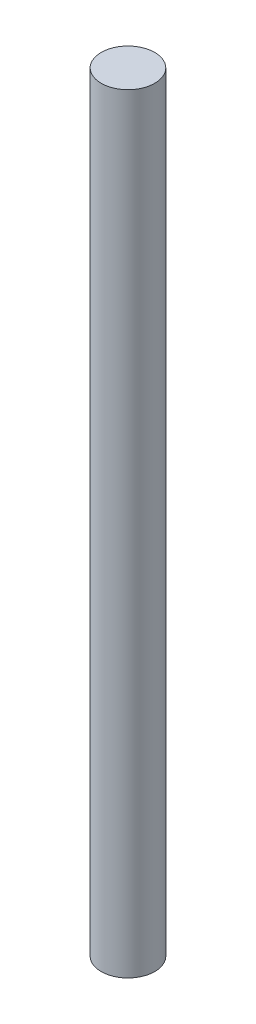
ISO-10303-21;
HEADER;
FILE_DESCRIPTION(('STEP AP214'),'2;1');
FILE_NAME('part.step','',(''),(''),'','','');
FILE_SCHEMA(('AUTOMOTIVE_DESIGN { 1 0 10303 214 1 1 1 1 }'));
ENDSEC;
DATA;
#1=APPLICATION_CONTEXT('core data for automotive mechanical design processes');
#2=APPLICATION_PROTOCOL_DEFINITION('international standard','automotive_design',2000,#1);
#3=PRODUCT_CONTEXT('',#1,'mechanical');
#4=PRODUCT('Part','Part','',(#3));
#5=PRODUCT_RELATED_PRODUCT_CATEGORY('part','',(#4));
#6=PRODUCT_DEFINITION_FORMATION('','',#4);
#7=PRODUCT_DEFINITION_CONTEXT('part definition',#1,'design');
#8=PRODUCT_DEFINITION('design','',#6,#7);
#9=PRODUCT_DEFINITION_SHAPE('','',#8);
#10=(LENGTH_UNIT() NAMED_UNIT(*) SI_UNIT(.MILLI.,.METRE.));
#11=(NAMED_UNIT(*) PLANE_ANGLE_UNIT() SI_UNIT($,.RADIAN.));
#12=(NAMED_UNIT(*) SI_UNIT($,.STERADIAN.) SOLID_ANGLE_UNIT());
#13=UNCERTAINTY_MEASURE_WITH_UNIT(LENGTH_MEASURE(1.E-05),#10,'distance_accuracy_value','');
#14=(GEOMETRIC_REPRESENTATION_CONTEXT(3) GLOBAL_UNCERTAINTY_ASSIGNED_CONTEXT((#13)) GLOBAL_UNIT_ASSIGNED_CONTEXT((#10,
#11,#12)) REPRESENTATION_CONTEXT('',''));
#15=CARTESIAN_POINT('',(0.,0.,0.));
#16=DIRECTION('',(0.,0.,1.));
#17=DIRECTION('',(1.,0.,0.));
#18=AXIS2_PLACEMENT_3D('',#15,#16,#17);
#19=CARTESIAN_POINT('',(0.,115.,0.));
#20=DIRECTION('',(0.,-1.,0.));
#21=DIRECTION('',(0.,0.,-1.));
#22=AXIS2_PLACEMENT_3D('',#19,#20,#21);
#23=CYLINDRICAL_SURFACE('',#22,4.);
#24=CARTESIAN_POINT('',(0.,115.,0.));
#25=DIRECTION('',(0.,1.,0.));
#26=DIRECTION('',(0.,0.,1.));
#27=AXIS2_PLACEMENT_3D('',#24,#25,#26);
#28=CIRCLE('',#27,4.);
#29=CARTESIAN_POINT('',(0.,115.,4.));
#30=VERTEX_POINT('',#29);
#31=EDGE_CURVE('E10',#30,#30,#28,.T.);
#32=ORIENTED_EDGE('',*,*,#31,.F.);
#33=EDGE_LOOP('',(#32));
#34=FACE_BOUND('',#33,.T.);
#35=CARTESIAN_POINT('',(0.,0.,0.));
#36=DIRECTION('',(0.,1.,0.));
#37=DIRECTION('',(0.,0.,1.));
#38=AXIS2_PLACEMENT_3D('',#35,#36,#37);
#39=CIRCLE('',#38,4.);
#40=CARTESIAN_POINT('',(0.,0.,4.));
#41=VERTEX_POINT('',#40);
#42=EDGE_CURVE('E46',#41,#41,#39,.T.);
#43=ORIENTED_EDGE('',*,*,#42,.T.);
#44=EDGE_LOOP('',(#43));
#45=FACE_BOUND('',#44,.T.);
#46=ADVANCED_FACE('F43',(#34,#45),#23,.T.);
#47=CARTESIAN_POINT('',(0.,115.,0.));
#48=DIRECTION('',(0.,1.,0.));
#49=DIRECTION('',(0.,0.,1.));
#50=AXIS2_PLACEMENT_3D('',#47,#48,#49);
#51=PLANE('',#50);
#52=ORIENTED_EDGE('',*,*,#31,.T.);
#53=EDGE_LOOP('',(#52));
#54=FACE_BOUND('',#53,.T.);
#55=ADVANCED_FACE('F60',(#54),#51,.T.);
#56=CARTESIAN_POINT('',(0.,0.,0.));
#57=DIRECTION('',(0.,1.,0.));
#58=DIRECTION('',(0.,0.,1.));
#59=AXIS2_PLACEMENT_3D('',#56,#57,#58);
#60=PLANE('',#59);
#61=ORIENTED_EDGE('',*,*,#42,.F.);
#62=EDGE_LOOP('',(#61));
#63=FACE_BOUND('',#62,.T.);
#64=ADVANCED_FACE('F58',(#63),#60,.F.);
#65=CLOSED_SHELL('',(#46,#55,#64));
#66=MANIFOLD_SOLID_BREP('B2',#65);
#67=ADVANCED_BREP_SHAPE_REPRESENTATION('',(#18,#66),#14);
#68=SHAPE_DEFINITION_REPRESENTATION(#9,#67);
ENDSEC;
END-ISO-10303-21;
